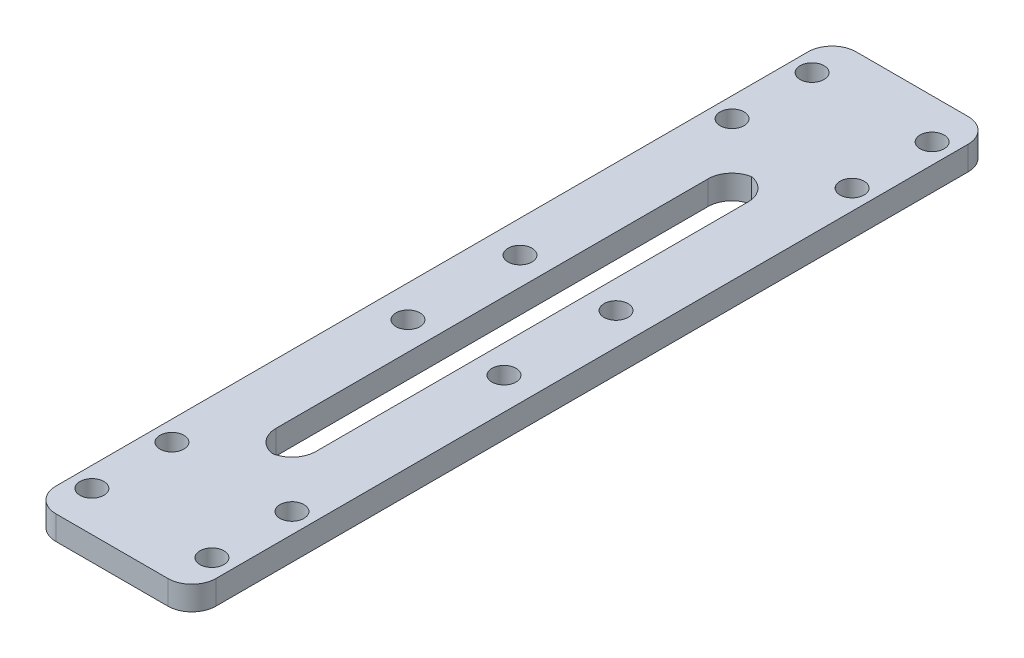
ISO-10303-21;
HEADER;
FILE_DESCRIPTION(('STEP AP214'),'2;1');
FILE_NAME('part.step','',(''),(''),'','','');
FILE_SCHEMA(('AUTOMOTIVE_DESIGN { 1 0 10303 214 1 1 1 1 }'));
ENDSEC;
DATA;
#1=APPLICATION_CONTEXT('core data for automotive mechanical design processes');
#2=APPLICATION_PROTOCOL_DEFINITION('international standard','automotive_design',2000,#1);
#3=PRODUCT_CONTEXT('',#1,'mechanical');
#4=PRODUCT('Part','Part','',(#3));
#5=PRODUCT_RELATED_PRODUCT_CATEGORY('part','',(#4));
#6=PRODUCT_DEFINITION_FORMATION('','',#4);
#7=PRODUCT_DEFINITION_CONTEXT('part definition',#1,'design');
#8=PRODUCT_DEFINITION('design','',#6,#7);
#9=PRODUCT_DEFINITION_SHAPE('','',#8);
#10=(LENGTH_UNIT() NAMED_UNIT(*) SI_UNIT(.MILLI.,.METRE.));
#11=(NAMED_UNIT(*) PLANE_ANGLE_UNIT() SI_UNIT($,.RADIAN.));
#12=(NAMED_UNIT(*) SI_UNIT($,.STERADIAN.) SOLID_ANGLE_UNIT());
#13=UNCERTAINTY_MEASURE_WITH_UNIT(LENGTH_MEASURE(1.E-05),#10,'distance_accuracy_value','');
#14=(GEOMETRIC_REPRESENTATION_CONTEXT(3) GLOBAL_UNCERTAINTY_ASSIGNED_CONTEXT((#13)) GLOBAL_UNIT_ASSIGNED_CONTEXT((#10,
#11,#12)) REPRESENTATION_CONTEXT('',''));
#15=CARTESIAN_POINT('',(0.,0.,0.));
#16=DIRECTION('',(0.,0.,1.));
#17=DIRECTION('',(1.,0.,0.));
#18=AXIS2_PLACEMENT_3D('',#15,#16,#17);
#19=CARTESIAN_POINT('',(10.,3.,50.));
#20=DIRECTION('',(-1.,0.,0.));
#21=DIRECTION('',(0.,0.,1.));
#22=AXIS2_PLACEMENT_3D('',#19,#20,#21);
#23=PLANE('',#22);
#24=DIRECTION('',(0.,0.,-1.));
#25=VECTOR('',#24,1.);
#26=CARTESIAN_POINT('',(10.,0.,50.));
#27=LINE('',#26,#25);
#28=CARTESIAN_POINT('',(10.,0.,47.));
#29=VERTEX_POINT('',#28);
#30=CARTESIAN_POINT('',(10.,0.,-47.));
#31=VERTEX_POINT('',#30);
#32=EDGE_CURVE('E239',#29,#31,#27,.T.);
#33=ORIENTED_EDGE('',*,*,#32,.T.);
#34=DIRECTION('',(0.,-1.,0.));
#35=VECTOR('',#34,1.);
#36=CARTESIAN_POINT('',(10.,3.,-47.));
#37=LINE('',#36,#35);
#38=CARTESIAN_POINT('',(10.,3.,-47.));
#39=VERTEX_POINT('',#38);
#40=EDGE_CURVE('E207',#31,#39,#37,.F.);
#41=ORIENTED_EDGE('',*,*,#40,.T.);
#42=DIRECTION('',(0.,0.,-1.));
#43=VECTOR('',#42,1.);
#44=CARTESIAN_POINT('',(10.,3.,50.));
#45=LINE('',#44,#43);
#46=CARTESIAN_POINT('',(10.,3.,47.));
#47=VERTEX_POINT('',#46);
#48=EDGE_CURVE('E238',#47,#39,#45,.T.);
#49=ORIENTED_EDGE('',*,*,#48,.F.);
#50=DIRECTION('',(0.,-1.,0.));
#51=VECTOR('',#50,1.);
#52=CARTESIAN_POINT('',(10.,3.,47.));
#53=LINE('',#52,#51);
#54=EDGE_CURVE('E204',#47,#29,#53,.T.);
#55=ORIENTED_EDGE('',*,*,#54,.T.);
#56=EDGE_LOOP('',(#33,#41,#49,#55));
#57=FACE_BOUND('',#56,.T.);
#58=ADVANCED_FACE('F35',(#57),#23,.F.);
#59=CARTESIAN_POINT('',(-10.,3.,-50.));
#60=DIRECTION('',(0.,0.,1.));
#61=DIRECTION('',(1.,0.,0.));
#62=AXIS2_PLACEMENT_3D('',#59,#60,#61);
#63=PLANE('',#62);
#64=DIRECTION('',(-1.,0.,0.));
#65=VECTOR('',#64,1.);
#66=CARTESIAN_POINT('',(-10.,3.,-50.));
#67=LINE('',#66,#65);
#68=CARTESIAN_POINT('',(7.,3.,-50.));
#69=VERTEX_POINT('',#68);
#70=CARTESIAN_POINT('',(-7.,3.,-50.));
#71=VERTEX_POINT('',#70);
#72=EDGE_CURVE('E247',#69,#71,#67,.T.);
#73=ORIENTED_EDGE('',*,*,#72,.F.);
#74=DIRECTION('',(0.,-1.,0.));
#75=VECTOR('',#74,1.);
#76=CARTESIAN_POINT('',(7.,3.,-50.));
#77=LINE('',#76,#75);
#78=CARTESIAN_POINT('',(7.,0.,-50.));
#79=VERTEX_POINT('',#78);
#80=EDGE_CURVE('E193',#69,#79,#77,.T.);
#81=ORIENTED_EDGE('',*,*,#80,.T.);
#82=DIRECTION('',(-1.,0.,0.));
#83=VECTOR('',#82,1.);
#84=CARTESIAN_POINT('',(-10.,0.,-50.));
#85=LINE('',#84,#83);
#86=CARTESIAN_POINT('',(-7.,0.,-50.));
#87=VERTEX_POINT('',#86);
#88=EDGE_CURVE('E236',#79,#87,#85,.T.);
#89=ORIENTED_EDGE('',*,*,#88,.T.);
#90=DIRECTION('',(0.,-1.,0.));
#91=VECTOR('',#90,1.);
#92=CARTESIAN_POINT('',(-7.,3.,-50.));
#93=LINE('',#92,#91);
#94=EDGE_CURVE('E185',#87,#71,#93,.F.);
#95=ORIENTED_EDGE('',*,*,#94,.T.);
#96=EDGE_LOOP('',(#73,#81,#89,#95));
#97=FACE_BOUND('',#96,.T.);
#98=ADVANCED_FACE('F374',(#97),#63,.F.);
#99=CARTESIAN_POINT('',(-10.,3.,50.));
#100=DIRECTION('',(1.,0.,0.));
#101=DIRECTION('',(0.,0.,-1.));
#102=AXIS2_PLACEMENT_3D('',#99,#100,#101);
#103=PLANE('',#102);
#104=DIRECTION('',(0.,0.,1.));
#105=VECTOR('',#104,1.);
#106=CARTESIAN_POINT('',(-10.,3.,50.));
#107=LINE('',#106,#105);
#108=CARTESIAN_POINT('',(-10.,3.,-47.));
#109=VERTEX_POINT('',#108);
#110=CARTESIAN_POINT('',(-10.,3.,47.));
#111=VERTEX_POINT('',#110);
#112=EDGE_CURVE('E228',#109,#111,#107,.T.);
#113=ORIENTED_EDGE('',*,*,#112,.F.);
#114=DIRECTION('',(0.,-1.,0.));
#115=VECTOR('',#114,1.);
#116=CARTESIAN_POINT('',(-10.,3.,-47.));
#117=LINE('',#116,#115);
#118=CARTESIAN_POINT('',(-10.,0.,-47.));
#119=VERTEX_POINT('',#118);
#120=EDGE_CURVE('E218',#109,#119,#117,.T.);
#121=ORIENTED_EDGE('',*,*,#120,.T.);
#122=DIRECTION('',(0.,0.,1.));
#123=VECTOR('',#122,1.);
#124=CARTESIAN_POINT('',(-10.,0.,50.));
#125=LINE('',#124,#123);
#126=CARTESIAN_POINT('',(-10.,0.,47.));
#127=VERTEX_POINT('',#126);
#128=EDGE_CURVE('E226',#119,#127,#125,.T.);
#129=ORIENTED_EDGE('',*,*,#128,.T.);
#130=DIRECTION('',(0.,-1.,0.));
#131=VECTOR('',#130,1.);
#132=CARTESIAN_POINT('',(-10.,3.,47.));
#133=LINE('',#132,#131);
#134=EDGE_CURVE('E216',#127,#111,#133,.F.);
#135=ORIENTED_EDGE('',*,*,#134,.T.);
#136=EDGE_LOOP('',(#113,#121,#129,#135));
#137=FACE_BOUND('',#136,.T.);
#138=ADVANCED_FACE('F225',(#137),#103,.F.);
#139=CARTESIAN_POINT('',(-10.,3.,50.));
#140=DIRECTION('',(0.,0.,-1.));
#141=DIRECTION('',(-1.,0.,0.));
#142=AXIS2_PLACEMENT_3D('',#139,#140,#141);
#143=PLANE('',#142);
#144=DIRECTION('',(1.,0.,0.));
#145=VECTOR('',#144,1.);
#146=CARTESIAN_POINT('',(-10.,3.,50.));
#147=LINE('',#146,#145);
#148=CARTESIAN_POINT('',(-7.,3.,50.));
#149=VERTEX_POINT('',#148);
#150=CARTESIAN_POINT('',(7.,3.,50.));
#151=VERTEX_POINT('',#150);
#152=EDGE_CURVE('E169',#149,#151,#147,.T.);
#153=ORIENTED_EDGE('',*,*,#152,.F.);
#154=DIRECTION('',(0.,-1.,0.));
#155=VECTOR('',#154,1.);
#156=CARTESIAN_POINT('',(-7.,3.,50.));
#157=LINE('',#156,#155);
#158=CARTESIAN_POINT('',(-7.,0.,50.));
#159=VERTEX_POINT('',#158);
#160=EDGE_CURVE('E11',#149,#159,#157,.T.);
#161=ORIENTED_EDGE('',*,*,#160,.T.);
#162=DIRECTION('',(1.,0.,0.));
#163=VECTOR('',#162,1.);
#164=CARTESIAN_POINT('',(-10.,0.,50.));
#165=LINE('',#164,#163);
#166=CARTESIAN_POINT('',(7.,0.,50.));
#167=VERTEX_POINT('',#166);
#168=EDGE_CURVE('E235',#159,#167,#165,.T.);
#169=ORIENTED_EDGE('',*,*,#168,.T.);
#170=DIRECTION('',(0.,-1.,0.));
#171=VECTOR('',#170,1.);
#172=CARTESIAN_POINT('',(7.,3.,50.));
#173=LINE('',#172,#171);
#174=EDGE_CURVE('E43',#167,#151,#173,.F.);
#175=ORIENTED_EDGE('',*,*,#174,.T.);
#176=EDGE_LOOP('',(#153,#161,#169,#175));
#177=FACE_BOUND('',#176,.T.);
#178=ADVANCED_FACE('F341',(#177),#143,.F.);
#179=CARTESIAN_POINT('',(0.,3.,0.));
#180=DIRECTION('',(0.,-1.,0.));
#181=DIRECTION('',(0.,0.,-1.));
#182=AXIS2_PLACEMENT_3D('',#179,#180,#181);
#183=PLANE('',#182);
#184=CARTESIAN_POINT('',(-6.,3.,7.));
#185=DIRECTION('',(0.,1.,0.));
#186=DIRECTION('',(0.,0.,-1.));
#187=AXIS2_PLACEMENT_3D('',#184,#185,#186);
#188=CIRCLE('',#187,1.5);
#189=CARTESIAN_POINT('',(-6.,3.,5.5));
#190=VERTEX_POINT('',#189);
#191=EDGE_CURVE('E310',#190,#190,#188,.T.);
#192=ORIENTED_EDGE('',*,*,#191,.F.);
#193=EDGE_LOOP('',(#192));
#194=FACE_BOUND('',#193,.T.);
#195=CARTESIAN_POINT('',(6.,3.,7.));
#196=DIRECTION('',(0.,1.,0.));
#197=DIRECTION('',(0.,0.,1.));
#198=AXIS2_PLACEMENT_3D('',#195,#196,#197);
#199=CIRCLE('',#198,1.5);
#200=CARTESIAN_POINT('',(6.,3.,8.5));
#201=VERTEX_POINT('',#200);
#202=EDGE_CURVE('E316',#201,#201,#199,.T.);
#203=ORIENTED_EDGE('',*,*,#202,.F.);
#204=EDGE_LOOP('',(#203));
#205=FACE_BOUND('',#204,.T.);
#206=CARTESIAN_POINT('',(6.,3.,-7.));
#207=DIRECTION('',(0.,1.,0.));
#208=DIRECTION('',(0.,0.,-1.));
#209=AXIS2_PLACEMENT_3D('',#206,#207,#208);
#210=CIRCLE('',#209,1.5);
#211=CARTESIAN_POINT('',(6.,3.,-8.5));
#212=VERTEX_POINT('',#211);
#213=EDGE_CURVE('E322',#212,#212,#210,.T.);
#214=ORIENTED_EDGE('',*,*,#213,.F.);
#215=EDGE_LOOP('',(#214));
#216=FACE_BOUND('',#215,.T.);
#217=CARTESIAN_POINT('',(-6.,3.,-7.));
#218=DIRECTION('',(0.,1.,0.));
#219=DIRECTION('',(0.,0.,1.));
#220=AXIS2_PLACEMENT_3D('',#217,#218,#219);
#221=CIRCLE('',#220,1.5);
#222=CARTESIAN_POINT('',(-6.,3.,-5.5));
#223=VERTEX_POINT('',#222);
#224=EDGE_CURVE('E304',#223,#223,#221,.T.);
#225=ORIENTED_EDGE('',*,*,#224,.F.);
#226=EDGE_LOOP('',(#225));
#227=FACE_BOUND('',#226,.T.);
#228=CARTESIAN_POINT('',(0.500000000000001,3.,-27.));
#229=DIRECTION('',(0.,-1.,0.));
#230=DIRECTION('',(0.,0.,-1.));
#231=AXIS2_PLACEMENT_3D('',#228,#229,#230);
#232=CIRCLE('',#231,3.);
#233=CARTESIAN_POINT('',(-2.5,3.,-27.));
#234=VERTEX_POINT('',#233);
#235=CARTESIAN_POINT('',(0.,3.,-29.9580398915498));
#236=VERTEX_POINT('',#235);
#237=EDGE_CURVE('E150',#234,#236,#232,.T.);
#238=ORIENTED_EDGE('',*,*,#237,.T.);
#239=CARTESIAN_POINT('',(-0.499999999999999,3.,-27.));
#240=DIRECTION('',(0.,-1.,0.));
#241=DIRECTION('',(0.,0.,-1.));
#242=AXIS2_PLACEMENT_3D('',#239,#240,#241);
#243=CIRCLE('',#242,3.);
#244=CARTESIAN_POINT('',(2.5,3.,-27.));
#245=VERTEX_POINT('',#244);
#246=EDGE_CURVE('E149',#236,#245,#243,.T.);
#247=ORIENTED_EDGE('',*,*,#246,.T.);
#248=DIRECTION('',(0.,0.,1.));
#249=VECTOR('',#248,1.);
#250=CARTESIAN_POINT('',(2.5,3.,0.));
#251=LINE('',#250,#249);
#252=CARTESIAN_POINT('',(2.5,3.,27.));
#253=VERTEX_POINT('',#252);
#254=EDGE_CURVE('E297',#245,#253,#251,.T.);
#255=ORIENTED_EDGE('',*,*,#254,.T.);
#256=CARTESIAN_POINT('',(-0.499999999999999,3.,27.));
#257=DIRECTION('',(0.,-1.,0.));
#258=DIRECTION('',(0.,0.,-1.));
#259=AXIS2_PLACEMENT_3D('',#256,#257,#258);
#260=CIRCLE('',#259,3.);
#261=CARTESIAN_POINT('',(0.,3.,29.9580398915498));
#262=VERTEX_POINT('',#261);
#263=EDGE_CURVE('E181',#253,#262,#260,.T.);
#264=ORIENTED_EDGE('',*,*,#263,.T.);
#265=CARTESIAN_POINT('',(0.500000000000001,3.,27.));
#266=DIRECTION('',(0.,-1.,0.));
#267=DIRECTION('',(0.,0.,-1.));
#268=AXIS2_PLACEMENT_3D('',#265,#266,#267);
#269=CIRCLE('',#268,3.);
#270=CARTESIAN_POINT('',(-2.5,3.,27.));
#271=VERTEX_POINT('',#270);
#272=EDGE_CURVE('E177',#262,#271,#269,.T.);
#273=ORIENTED_EDGE('',*,*,#272,.T.);
#274=DIRECTION('',(0.,0.,-1.));
#275=VECTOR('',#274,1.);
#276=CARTESIAN_POINT('',(-2.5,3.,0.));
#277=LINE('',#276,#275);
#278=EDGE_CURVE('E161',#271,#234,#277,.T.);
#279=ORIENTED_EDGE('',*,*,#278,.T.);
#280=EDGE_LOOP('',(#238,#247,#255,#264,#273,#279));
#281=FACE_BOUND('',#280,.T.);
#282=CARTESIAN_POINT('',(7.50000000000002,3.,35.));
#283=DIRECTION('',(0.,1.,0.));
#284=DIRECTION('',(0.,0.,1.));
#285=AXIS2_PLACEMENT_3D('',#282,#283,#284);
#286=CIRCLE('',#285,1.50000000000001);
#287=CARTESIAN_POINT('',(7.50000000000002,3.,36.5));
#288=VERTEX_POINT('',#287);
#289=EDGE_CURVE('E270',#288,#288,#286,.T.);
#290=ORIENTED_EDGE('',*,*,#289,.F.);
#291=EDGE_LOOP('',(#290));
#292=FACE_BOUND('',#291,.T.);
#293=CARTESIAN_POINT('',(7.5,3.,-35.));
#294=DIRECTION('',(0.,1.,0.));
#295=DIRECTION('',(0.,0.,-1.));
#296=AXIS2_PLACEMENT_3D('',#293,#294,#295);
#297=CIRCLE('',#296,1.50000000000001);
#298=CARTESIAN_POINT('',(7.5,3.,-36.5));
#299=VERTEX_POINT('',#298);
#300=EDGE_CURVE('E277',#299,#299,#297,.T.);
#301=ORIENTED_EDGE('',*,*,#300,.F.);
#302=EDGE_LOOP('',(#301));
#303=FACE_BOUND('',#302,.T.);
#304=CARTESIAN_POINT('',(7.5,3.,-45.));
#305=DIRECTION('',(0.,1.,0.));
#306=DIRECTION('',(0.,0.,-1.));
#307=AXIS2_PLACEMENT_3D('',#304,#305,#306);
#308=CIRCLE('',#307,1.5);
#309=CARTESIAN_POINT('',(7.5,3.,-46.5));
#310=VERTEX_POINT('',#309);
#311=EDGE_CURVE('E258',#310,#310,#308,.T.);
#312=ORIENTED_EDGE('',*,*,#311,.F.);
#313=EDGE_LOOP('',(#312));
#314=FACE_BOUND('',#313,.T.);
#315=CARTESIAN_POINT('',(-7.5,3.,-35.));
#316=DIRECTION('',(0.,1.,0.));
#317=DIRECTION('',(0.,0.,1.));
#318=AXIS2_PLACEMENT_3D('',#315,#316,#317);
#319=CIRCLE('',#318,1.5);
#320=CARTESIAN_POINT('',(-7.5,3.,-33.5));
#321=VERTEX_POINT('',#320);
#322=EDGE_CURVE('E265',#321,#321,#319,.T.);
#323=ORIENTED_EDGE('',*,*,#322,.F.);
#324=EDGE_LOOP('',(#323));
#325=FACE_BOUND('',#324,.T.);
#326=CARTESIAN_POINT('',(-7.49999999999997,3.,45.));
#327=DIRECTION('',(0.,1.,0.));
#328=DIRECTION('',(0.,0.,-1.));
#329=AXIS2_PLACEMENT_3D('',#326,#327,#328);
#330=CIRCLE('',#329,1.5);
#331=CARTESIAN_POINT('',(-7.49999999999997,3.,43.5));
#332=VERTEX_POINT('',#331);
#333=EDGE_CURVE('E294',#332,#332,#330,.T.);
#334=ORIENTED_EDGE('',*,*,#333,.F.);
#335=EDGE_LOOP('',(#334));
#336=FACE_BOUND('',#335,.T.);
#337=CARTESIAN_POINT('',(-7.5,3.,35.));
#338=DIRECTION('',(0.,1.,0.));
#339=DIRECTION('',(0.,0.,-1.));
#340=AXIS2_PLACEMENT_3D('',#337,#338,#339);
#341=CIRCLE('',#340,1.5);
#342=CARTESIAN_POINT('',(-7.5,3.,33.5));
#343=VERTEX_POINT('',#342);
#344=EDGE_CURVE('E282',#343,#343,#341,.T.);
#345=ORIENTED_EDGE('',*,*,#344,.F.);
#346=EDGE_LOOP('',(#345));
#347=FACE_BOUND('',#346,.T.);
#348=CARTESIAN_POINT('',(7.49999999999998,3.,45.));
#349=DIRECTION('',(0.,1.,0.));
#350=DIRECTION('',(0.,0.,1.));
#351=AXIS2_PLACEMENT_3D('',#348,#349,#350);
#352=CIRCLE('',#351,1.5);
#353=CARTESIAN_POINT('',(7.49999999999998,3.,46.5));
#354=VERTEX_POINT('',#353);
#355=EDGE_CURVE('E289',#354,#354,#352,.T.);
#356=ORIENTED_EDGE('',*,*,#355,.F.);
#357=EDGE_LOOP('',(#356));
#358=FACE_BOUND('',#357,.T.);
#359=CARTESIAN_POINT('',(-7.5,3.,-45.));
#360=DIRECTION('',(0.,1.,0.));
#361=DIRECTION('',(0.,0.,1.));
#362=AXIS2_PLACEMENT_3D('',#359,#360,#361);
#363=CIRCLE('',#362,1.5);
#364=CARTESIAN_POINT('',(-7.5,3.,-43.5));
#365=VERTEX_POINT('',#364);
#366=EDGE_CURVE('E252',#365,#365,#363,.T.);
#367=ORIENTED_EDGE('',*,*,#366,.F.);
#368=EDGE_LOOP('',(#367));
#369=FACE_BOUND('',#368,.T.);
#370=ORIENTED_EDGE('',*,*,#48,.T.);
#371=CARTESIAN_POINT('',(7.,3.,-47.));
#372=DIRECTION('',(0.,-1.,0.));
#373=DIRECTION('',(0.,0.,-1.));
#374=AXIS2_PLACEMENT_3D('',#371,#372,#373);
#375=CIRCLE('',#374,3.);
#376=EDGE_CURVE('E214',#39,#69,#375,.F.);
#377=ORIENTED_EDGE('',*,*,#376,.T.);
#378=ORIENTED_EDGE('',*,*,#72,.T.);
#379=CARTESIAN_POINT('',(-7.,3.,-47.));
#380=DIRECTION('',(0.,-1.,0.));
#381=DIRECTION('',(0.,0.,-1.));
#382=AXIS2_PLACEMENT_3D('',#379,#380,#381);
#383=CIRCLE('',#382,3.);
#384=EDGE_CURVE('E212',#71,#109,#383,.F.);
#385=ORIENTED_EDGE('',*,*,#384,.T.);
#386=ORIENTED_EDGE('',*,*,#112,.T.);
#387=CARTESIAN_POINT('',(-7.,3.,47.));
#388=DIRECTION('',(0.,-1.,0.));
#389=DIRECTION('',(0.,0.,-1.));
#390=AXIS2_PLACEMENT_3D('',#387,#388,#389);
#391=CIRCLE('',#390,3.);
#392=EDGE_CURVE('E56',#111,#149,#391,.F.);
#393=ORIENTED_EDGE('',*,*,#392,.T.);
#394=ORIENTED_EDGE('',*,*,#152,.T.);
#395=CARTESIAN_POINT('',(7.,3.,47.));
#396=DIRECTION('',(0.,-1.,0.));
#397=DIRECTION('',(0.,0.,-1.));
#398=AXIS2_PLACEMENT_3D('',#395,#396,#397);
#399=CIRCLE('',#398,3.);
#400=EDGE_CURVE('E209',#151,#47,#399,.F.);
#401=ORIENTED_EDGE('',*,*,#400,.T.);
#402=EDGE_LOOP('',(#370,#377,#378,#385,#386,#393,#394,#401));
#403=FACE_BOUND('',#402,.T.);
#404=ADVANCED_FACE('F338',(#194,#205,#216,#227,#281,#292,#303,#314,#325,#336,#347,#358,#369,
#403),#183,.F.);
#405=CARTESIAN_POINT('',(0.,0.,0.));
#406=DIRECTION('',(0.,-1.,0.));
#407=DIRECTION('',(0.,0.,-1.));
#408=AXIS2_PLACEMENT_3D('',#405,#406,#407);
#409=PLANE('',#408);
#410=CARTESIAN_POINT('',(-6.,0.,7.));
#411=DIRECTION('',(0.,1.,0.));
#412=DIRECTION('',(0.,0.,-1.));
#413=AXIS2_PLACEMENT_3D('',#410,#411,#412);
#414=CIRCLE('',#413,1.5);
#415=CARTESIAN_POINT('',(-6.,0.,5.5));
#416=VERTEX_POINT('',#415);
#417=EDGE_CURVE('E313',#416,#416,#414,.T.);
#418=ORIENTED_EDGE('',*,*,#417,.T.);
#419=EDGE_LOOP('',(#418));
#420=FACE_BOUND('',#419,.T.);
#421=CARTESIAN_POINT('',(6.,0.,7.));
#422=DIRECTION('',(0.,1.,0.));
#423=DIRECTION('',(0.,0.,1.));
#424=AXIS2_PLACEMENT_3D('',#421,#422,#423);
#425=CIRCLE('',#424,1.5);
#426=CARTESIAN_POINT('',(6.,0.,8.5));
#427=VERTEX_POINT('',#426);
#428=EDGE_CURVE('E319',#427,#427,#425,.T.);
#429=ORIENTED_EDGE('',*,*,#428,.T.);
#430=EDGE_LOOP('',(#429));
#431=FACE_BOUND('',#430,.T.);
#432=CARTESIAN_POINT('',(6.,0.,-7.));
#433=DIRECTION('',(0.,1.,0.));
#434=DIRECTION('',(0.,0.,-1.));
#435=AXIS2_PLACEMENT_3D('',#432,#433,#434);
#436=CIRCLE('',#435,1.5);
#437=CARTESIAN_POINT('',(6.,0.,-8.5));
#438=VERTEX_POINT('',#437);
#439=EDGE_CURVE('E307',#438,#438,#436,.T.);
#440=ORIENTED_EDGE('',*,*,#439,.T.);
#441=EDGE_LOOP('',(#440));
#442=FACE_BOUND('',#441,.T.);
#443=CARTESIAN_POINT('',(-6.,0.,-7.));
#444=DIRECTION('',(0.,1.,0.));
#445=DIRECTION('',(0.,0.,1.));
#446=AXIS2_PLACEMENT_3D('',#443,#444,#445);
#447=CIRCLE('',#446,1.5);
#448=CARTESIAN_POINT('',(-6.,0.,-5.5));
#449=VERTEX_POINT('',#448);
#450=EDGE_CURVE('E191',#449,#449,#447,.T.);
#451=ORIENTED_EDGE('',*,*,#450,.T.);
#452=EDGE_LOOP('',(#451));
#453=FACE_BOUND('',#452,.T.);
#454=CARTESIAN_POINT('',(0.500000000000001,0.,27.));
#455=DIRECTION('',(0.,-1.,0.));
#456=DIRECTION('',(0.,0.,-1.));
#457=AXIS2_PLACEMENT_3D('',#454,#455,#456);
#458=CIRCLE('',#457,3.);
#459=CARTESIAN_POINT('',(-2.5,0.,27.));
#460=VERTEX_POINT('',#459);
#461=CARTESIAN_POINT('',(0.,0.,29.9580398915498));
#462=VERTEX_POINT('',#461);
#463=EDGE_CURVE('E179',#460,#462,#458,.F.);
#464=ORIENTED_EDGE('',*,*,#463,.T.);
#465=CARTESIAN_POINT('',(-0.499999999999999,0.,27.));
#466=DIRECTION('',(0.,-1.,0.));
#467=DIRECTION('',(0.,0.,-1.));
#468=AXIS2_PLACEMENT_3D('',#465,#466,#467);
#469=CIRCLE('',#468,3.);
#470=CARTESIAN_POINT('',(2.5,0.,27.));
#471=VERTEX_POINT('',#470);
#472=EDGE_CURVE('E183',#462,#471,#469,.F.);
#473=ORIENTED_EDGE('',*,*,#472,.T.);
#474=DIRECTION('',(0.,0.,-1.));
#475=VECTOR('',#474,1.);
#476=CARTESIAN_POINT('',(2.5,0.,30.));
#477=LINE('',#476,#475);
#478=CARTESIAN_POINT('',(2.5,0.,-27.));
#479=VERTEX_POINT('',#478);
#480=EDGE_CURVE('E162',#471,#479,#477,.T.);
#481=ORIENTED_EDGE('',*,*,#480,.T.);
#482=CARTESIAN_POINT('',(-0.499999999999999,0.,-27.));
#483=DIRECTION('',(0.,-1.,0.));
#484=DIRECTION('',(0.,0.,-1.));
#485=AXIS2_PLACEMENT_3D('',#482,#483,#484);
#486=CIRCLE('',#485,3.);
#487=CARTESIAN_POINT('',(0.,0.,-29.9580398915498));
#488=VERTEX_POINT('',#487);
#489=EDGE_CURVE('E144',#479,#488,#486,.F.);
#490=ORIENTED_EDGE('',*,*,#489,.T.);
#491=CARTESIAN_POINT('',(0.500000000000001,0.,-27.));
#492=DIRECTION('',(0.,-1.,0.));
#493=DIRECTION('',(0.,0.,-1.));
#494=AXIS2_PLACEMENT_3D('',#491,#492,#493);
#495=CIRCLE('',#494,3.);
#496=CARTESIAN_POINT('',(-2.5,0.,-27.));
#497=VERTEX_POINT('',#496);
#498=EDGE_CURVE('E137',#488,#497,#495,.F.);
#499=ORIENTED_EDGE('',*,*,#498,.T.);
#500=DIRECTION('',(0.,0.,1.));
#501=VECTOR('',#500,1.);
#502=CARTESIAN_POINT('',(-2.5,0.,30.));
#503=LINE('',#502,#501);
#504=EDGE_CURVE('E141',#497,#460,#503,.T.);
#505=ORIENTED_EDGE('',*,*,#504,.T.);
#506=EDGE_LOOP('',(#464,#473,#481,#490,#499,#505));
#507=FACE_BOUND('',#506,.T.);
#508=CARTESIAN_POINT('',(7.50000000000002,0.,35.));
#509=DIRECTION('',(0.,1.,0.));
#510=DIRECTION('',(0.,0.,1.));
#511=AXIS2_PLACEMENT_3D('',#508,#509,#510);
#512=CIRCLE('',#511,1.50000000000001);
#513=CARTESIAN_POINT('',(7.50000000000002,0.,36.5));
#514=VERTEX_POINT('',#513);
#515=EDGE_CURVE('E273',#514,#514,#512,.T.);
#516=ORIENTED_EDGE('',*,*,#515,.T.);
#517=EDGE_LOOP('',(#516));
#518=FACE_BOUND('',#517,.T.);
#519=CARTESIAN_POINT('',(7.5,0.,-35.));
#520=DIRECTION('',(0.,1.,0.));
#521=DIRECTION('',(0.,0.,-1.));
#522=AXIS2_PLACEMENT_3D('',#519,#520,#521);
#523=CIRCLE('',#522,1.50000000000001);
#524=CARTESIAN_POINT('',(7.5,0.,-36.5));
#525=VERTEX_POINT('',#524);
#526=EDGE_CURVE('E262',#525,#525,#523,.T.);
#527=ORIENTED_EDGE('',*,*,#526,.T.);
#528=EDGE_LOOP('',(#527));
#529=FACE_BOUND('',#528,.T.);
#530=CARTESIAN_POINT('',(7.5,0.,-45.));
#531=DIRECTION('',(0.,1.,0.));
#532=DIRECTION('',(0.,0.,-1.));
#533=AXIS2_PLACEMENT_3D('',#530,#531,#532);
#534=CIRCLE('',#533,1.5);
#535=CARTESIAN_POINT('',(7.5,0.,-46.5));
#536=VERTEX_POINT('',#535);
#537=EDGE_CURVE('E261',#536,#536,#534,.T.);
#538=ORIENTED_EDGE('',*,*,#537,.T.);
#539=EDGE_LOOP('',(#538));
#540=FACE_BOUND('',#539,.T.);
#541=CARTESIAN_POINT('',(-7.5,0.,-35.));
#542=DIRECTION('',(0.,1.,0.));
#543=DIRECTION('',(0.,0.,1.));
#544=AXIS2_PLACEMENT_3D('',#541,#542,#543);
#545=CIRCLE('',#544,1.5);
#546=CARTESIAN_POINT('',(-7.5,0.,-33.5));
#547=VERTEX_POINT('',#546);
#548=EDGE_CURVE('E255',#547,#547,#545,.T.);
#549=ORIENTED_EDGE('',*,*,#548,.T.);
#550=EDGE_LOOP('',(#549));
#551=FACE_BOUND('',#550,.T.);
#552=CARTESIAN_POINT('',(-7.49999999999997,0.,45.));
#553=DIRECTION('',(0.,1.,0.));
#554=DIRECTION('',(0.,0.,-1.));
#555=AXIS2_PLACEMENT_3D('',#552,#553,#554);
#556=CIRCLE('',#555,1.5);
#557=CARTESIAN_POINT('',(-7.49999999999997,0.,43.5));
#558=VERTEX_POINT('',#557);
#559=EDGE_CURVE('E286',#558,#558,#556,.T.);
#560=ORIENTED_EDGE('',*,*,#559,.T.);
#561=EDGE_LOOP('',(#560));
#562=FACE_BOUND('',#561,.T.);
#563=CARTESIAN_POINT('',(-7.5,0.,35.));
#564=DIRECTION('',(0.,1.,0.));
#565=DIRECTION('',(0.,0.,-1.));
#566=AXIS2_PLACEMENT_3D('',#563,#564,#565);
#567=CIRCLE('',#566,1.5);
#568=CARTESIAN_POINT('',(-7.5,0.,33.5));
#569=VERTEX_POINT('',#568);
#570=EDGE_CURVE('E285',#569,#569,#567,.T.);
#571=ORIENTED_EDGE('',*,*,#570,.T.);
#572=EDGE_LOOP('',(#571));
#573=FACE_BOUND('',#572,.T.);
#574=CARTESIAN_POINT('',(7.49999999999998,0.,45.));
#575=DIRECTION('',(0.,1.,0.));
#576=DIRECTION('',(0.,0.,1.));
#577=AXIS2_PLACEMENT_3D('',#574,#575,#576);
#578=CIRCLE('',#577,1.5);
#579=CARTESIAN_POINT('',(7.49999999999998,0.,46.5));
#580=VERTEX_POINT('',#579);
#581=EDGE_CURVE('E274',#580,#580,#578,.T.);
#582=ORIENTED_EDGE('',*,*,#581,.T.);
#583=EDGE_LOOP('',(#582));
#584=FACE_BOUND('',#583,.T.);
#585=CARTESIAN_POINT('',(-7.5,0.,-45.));
#586=DIRECTION('',(0.,1.,0.));
#587=DIRECTION('',(0.,0.,1.));
#588=AXIS2_PLACEMENT_3D('',#585,#586,#587);
#589=CIRCLE('',#588,1.5);
#590=CARTESIAN_POINT('',(-7.5,0.,-43.5));
#591=VERTEX_POINT('',#590);
#592=EDGE_CURVE('E244',#591,#591,#589,.T.);
#593=ORIENTED_EDGE('',*,*,#592,.T.);
#594=EDGE_LOOP('',(#593));
#595=FACE_BOUND('',#594,.T.);
#596=ORIENTED_EDGE('',*,*,#88,.F.);
#597=CARTESIAN_POINT('',(7.,0.,-47.));
#598=DIRECTION('',(0.,-1.,0.));
#599=DIRECTION('',(0.,0.,-1.));
#600=AXIS2_PLACEMENT_3D('',#597,#598,#599);
#601=CIRCLE('',#600,3.);
#602=EDGE_CURVE('E202',#79,#31,#601,.T.);
#603=ORIENTED_EDGE('',*,*,#602,.T.);
#604=ORIENTED_EDGE('',*,*,#32,.F.);
#605=CARTESIAN_POINT('',(7.,0.,47.));
#606=DIRECTION('',(0.,-1.,0.));
#607=DIRECTION('',(0.,0.,-1.));
#608=AXIS2_PLACEMENT_3D('',#605,#606,#607);
#609=CIRCLE('',#608,3.);
#610=EDGE_CURVE('E196',#29,#167,#609,.T.);
#611=ORIENTED_EDGE('',*,*,#610,.T.);
#612=ORIENTED_EDGE('',*,*,#168,.F.);
#613=CARTESIAN_POINT('',(-7.,0.,47.));
#614=DIRECTION('',(0.,-1.,0.));
#615=DIRECTION('',(0.,0.,-1.));
#616=AXIS2_PLACEMENT_3D('',#613,#614,#615);
#617=CIRCLE('',#616,3.);
#618=EDGE_CURVE('E198',#159,#127,#617,.T.);
#619=ORIENTED_EDGE('',*,*,#618,.T.);
#620=ORIENTED_EDGE('',*,*,#128,.F.);
#621=CARTESIAN_POINT('',(-7.,0.,-47.));
#622=DIRECTION('',(0.,-1.,0.));
#623=DIRECTION('',(0.,0.,-1.));
#624=AXIS2_PLACEMENT_3D('',#621,#622,#623);
#625=CIRCLE('',#624,3.);
#626=EDGE_CURVE('E200',#119,#87,#625,.T.);
#627=ORIENTED_EDGE('',*,*,#626,.T.);
#628=EDGE_LOOP('',(#596,#603,#604,#611,#612,#619,#620,#627));
#629=FACE_BOUND('',#628,.T.);
#630=ADVANCED_FACE('F139',(#420,#431,#442,#453,#507,#518,#529,#540,#551,#562,#573,#584,#595,
#629),#409,.T.);
#631=CARTESIAN_POINT('',(-7.5,0.,-45.));
#632=DIRECTION('',(0.,1.,0.));
#633=DIRECTION('',(0.,0.,1.));
#634=AXIS2_PLACEMENT_3D('',#631,#632,#633);
#635=CYLINDRICAL_SURFACE('',#634,1.5);
#636=ORIENTED_EDGE('',*,*,#592,.F.);
#637=EDGE_LOOP('',(#636));
#638=FACE_BOUND('',#637,.T.);
#639=ORIENTED_EDGE('',*,*,#366,.T.);
#640=EDGE_LOOP('',(#639));
#641=FACE_BOUND('',#640,.T.);
#642=ADVANCED_FACE('F444',(#638,#641),#635,.F.);
#643=CARTESIAN_POINT('',(7.49999999999998,0.,45.));
#644=DIRECTION('',(0.,1.,0.));
#645=DIRECTION('',(0.,0.,1.));
#646=AXIS2_PLACEMENT_3D('',#643,#644,#645);
#647=CYLINDRICAL_SURFACE('',#646,1.5);
#648=ORIENTED_EDGE('',*,*,#581,.F.);
#649=EDGE_LOOP('',(#648));
#650=FACE_BOUND('',#649,.T.);
#651=ORIENTED_EDGE('',*,*,#355,.T.);
#652=EDGE_LOOP('',(#651));
#653=FACE_BOUND('',#652,.T.);
#654=ADVANCED_FACE('F441',(#650,#653),#647,.F.);
#655=CARTESIAN_POINT('',(-7.5,0.,35.));
#656=DIRECTION('',(0.,1.,0.));
#657=DIRECTION('',(0.,0.,1.));
#658=AXIS2_PLACEMENT_3D('',#655,#656,#657);
#659=CYLINDRICAL_SURFACE('',#658,1.5);
#660=ORIENTED_EDGE('',*,*,#570,.F.);
#661=EDGE_LOOP('',(#660));
#662=FACE_BOUND('',#661,.T.);
#663=ORIENTED_EDGE('',*,*,#344,.T.);
#664=EDGE_LOOP('',(#663));
#665=FACE_BOUND('',#664,.T.);
#666=ADVANCED_FACE('F439',(#662,#665),#659,.F.);
#667=CARTESIAN_POINT('',(-7.49999999999997,0.,45.));
#668=DIRECTION('',(0.,1.,0.));
#669=DIRECTION('',(0.,0.,1.));
#670=AXIS2_PLACEMENT_3D('',#667,#668,#669);
#671=CYLINDRICAL_SURFACE('',#670,1.5);
#672=ORIENTED_EDGE('',*,*,#559,.F.);
#673=EDGE_LOOP('',(#672));
#674=FACE_BOUND('',#673,.T.);
#675=ORIENTED_EDGE('',*,*,#333,.T.);
#676=EDGE_LOOP('',(#675));
#677=FACE_BOUND('',#676,.T.);
#678=ADVANCED_FACE('F435',(#674,#677),#671,.F.);
#679=CARTESIAN_POINT('',(-7.5,0.,-35.));
#680=DIRECTION('',(0.,1.,0.));
#681=DIRECTION('',(0.,0.,1.));
#682=AXIS2_PLACEMENT_3D('',#679,#680,#681);
#683=CYLINDRICAL_SURFACE('',#682,1.5);
#684=ORIENTED_EDGE('',*,*,#548,.F.);
#685=EDGE_LOOP('',(#684));
#686=FACE_BOUND('',#685,.T.);
#687=ORIENTED_EDGE('',*,*,#322,.T.);
#688=EDGE_LOOP('',(#687));
#689=FACE_BOUND('',#688,.T.);
#690=ADVANCED_FACE('F438',(#686,#689),#683,.F.);
#691=CARTESIAN_POINT('',(7.5,0.,-45.));
#692=DIRECTION('',(0.,1.,0.));
#693=DIRECTION('',(0.,0.,1.));
#694=AXIS2_PLACEMENT_3D('',#691,#692,#693);
#695=CYLINDRICAL_SURFACE('',#694,1.5);
#696=ORIENTED_EDGE('',*,*,#537,.F.);
#697=EDGE_LOOP('',(#696));
#698=FACE_BOUND('',#697,.T.);
#699=ORIENTED_EDGE('',*,*,#311,.T.);
#700=EDGE_LOOP('',(#699));
#701=FACE_BOUND('',#700,.T.);
#702=ADVANCED_FACE('F450',(#698,#701),#695,.F.);
#703=CARTESIAN_POINT('',(7.5,0.,-35.));
#704=DIRECTION('',(0.,1.,0.));
#705=DIRECTION('',(0.,0.,1.));
#706=AXIS2_PLACEMENT_3D('',#703,#704,#705);
#707=CYLINDRICAL_SURFACE('',#706,1.50000000000001);
#708=ORIENTED_EDGE('',*,*,#526,.F.);
#709=EDGE_LOOP('',(#708));
#710=FACE_BOUND('',#709,.T.);
#711=ORIENTED_EDGE('',*,*,#300,.T.);
#712=EDGE_LOOP('',(#711));
#713=FACE_BOUND('',#712,.T.);
#714=ADVANCED_FACE('F430',(#710,#713),#707,.F.);
#715=CARTESIAN_POINT('',(7.50000000000002,0.,35.));
#716=DIRECTION('',(0.,1.,0.));
#717=DIRECTION('',(0.,0.,1.));
#718=AXIS2_PLACEMENT_3D('',#715,#716,#717);
#719=CYLINDRICAL_SURFACE('',#718,1.50000000000001);
#720=ORIENTED_EDGE('',*,*,#515,.F.);
#721=EDGE_LOOP('',(#720));
#722=FACE_BOUND('',#721,.T.);
#723=ORIENTED_EDGE('',*,*,#289,.T.);
#724=EDGE_LOOP('',(#723));
#725=FACE_BOUND('',#724,.T.);
#726=ADVANCED_FACE('F423',(#722,#725),#719,.F.);
#727=CARTESIAN_POINT('',(2.5,0.,30.));
#728=DIRECTION('',(1.,0.,0.));
#729=DIRECTION('',(0.,0.,-1.));
#730=AXIS2_PLACEMENT_3D('',#727,#728,#729);
#731=PLANE('',#730);
#732=ORIENTED_EDGE('',*,*,#254,.F.);
#733=DIRECTION('',(0.,1.,0.));
#734=VECTOR('',#733,1.);
#735=CARTESIAN_POINT('',(2.5,0.,-27.));
#736=LINE('',#735,#734);
#737=EDGE_CURVE('E167',#245,#479,#736,.F.);
#738=ORIENTED_EDGE('',*,*,#737,.T.);
#739=ORIENTED_EDGE('',*,*,#480,.F.);
#740=DIRECTION('',(0.,1.,0.));
#741=VECTOR('',#740,1.);
#742=CARTESIAN_POINT('',(2.5,3.,27.));
#743=LINE('',#742,#741);
#744=EDGE_CURVE('E165',#471,#253,#743,.T.);
#745=ORIENTED_EDGE('',*,*,#744,.T.);
#746=EDGE_LOOP('',(#732,#738,#739,#745));
#747=FACE_BOUND('',#746,.T.);
#748=ADVANCED_FACE('F419',(#747),#731,.F.);
#749=CARTESIAN_POINT('',(-2.5,0.,30.));
#750=DIRECTION('',(-1.,0.,0.));
#751=DIRECTION('',(0.,0.,1.));
#752=AXIS2_PLACEMENT_3D('',#749,#750,#751);
#753=PLANE('',#752);
#754=ORIENTED_EDGE('',*,*,#504,.F.);
#755=DIRECTION('',(0.,1.,0.));
#756=VECTOR('',#755,1.);
#757=CARTESIAN_POINT('',(-2.5,3.,-27.));
#758=LINE('',#757,#756);
#759=EDGE_CURVE('E157',#497,#234,#758,.T.);
#760=ORIENTED_EDGE('',*,*,#759,.T.);
#761=ORIENTED_EDGE('',*,*,#278,.F.);
#762=DIRECTION('',(0.,1.,0.));
#763=VECTOR('',#762,1.);
#764=CARTESIAN_POINT('',(-2.5,0.,27.));
#765=LINE('',#764,#763);
#766=EDGE_CURVE('E160',#271,#460,#765,.F.);
#767=ORIENTED_EDGE('',*,*,#766,.T.);
#768=EDGE_LOOP('',(#754,#760,#761,#767));
#769=FACE_BOUND('',#768,.T.);
#770=ADVANCED_FACE('F155',(#769),#753,.F.);
#771=CARTESIAN_POINT('',(-0.499999999999999,0.,-27.));
#772=DIRECTION('',(0.,-1.,0.));
#773=DIRECTION('',(0.,0.,-1.));
#774=AXIS2_PLACEMENT_3D('',#771,#772,#773);
#775=CYLINDRICAL_SURFACE('',#774,3.);
#776=DIRECTION('',(0.,-1.,0.));
#777=VECTOR('',#776,1.);
#778=CARTESIAN_POINT('',(0.,1.5,-29.9580398915498));
#779=LINE('',#778,#777);
#780=EDGE_CURVE('E186',#488,#236,#779,.F.);
#781=ORIENTED_EDGE('',*,*,#780,.F.);
#782=ORIENTED_EDGE('',*,*,#489,.F.);
#783=ORIENTED_EDGE('',*,*,#737,.F.);
#784=ORIENTED_EDGE('',*,*,#246,.F.);
#785=EDGE_LOOP('',(#781,#782,#783,#784));
#786=FACE_BOUND('',#785,.T.);
#787=ADVANCED_FACE('F401',(#786),#775,.F.);
#788=CARTESIAN_POINT('',(0.500000000000001,0.,-27.));
#789=DIRECTION('',(0.,-1.,0.));
#790=DIRECTION('',(0.,0.,-1.));
#791=AXIS2_PLACEMENT_3D('',#788,#789,#790);
#792=CYLINDRICAL_SURFACE('',#791,3.);
#793=ORIENTED_EDGE('',*,*,#498,.F.);
#794=ORIENTED_EDGE('',*,*,#780,.T.);
#795=ORIENTED_EDGE('',*,*,#237,.F.);
#796=ORIENTED_EDGE('',*,*,#759,.F.);
#797=EDGE_LOOP('',(#793,#794,#795,#796));
#798=FACE_BOUND('',#797,.T.);
#799=ADVANCED_FACE('F164',(#798),#792,.F.);
#800=CARTESIAN_POINT('',(-0.499999999999999,0.,27.));
#801=DIRECTION('',(0.,-1.,0.));
#802=DIRECTION('',(0.,0.,-1.));
#803=AXIS2_PLACEMENT_3D('',#800,#801,#802);
#804=CYLINDRICAL_SURFACE('',#803,3.);
#805=ORIENTED_EDGE('',*,*,#744,.F.);
#806=ORIENTED_EDGE('',*,*,#472,.F.);
#807=DIRECTION('',(0.,-1.,0.));
#808=VECTOR('',#807,1.);
#809=CARTESIAN_POINT('',(0.,1.5,29.9580398915498));
#810=LINE('',#809,#808);
#811=EDGE_CURVE('E188',#262,#462,#810,.T.);
#812=ORIENTED_EDGE('',*,*,#811,.F.);
#813=ORIENTED_EDGE('',*,*,#263,.F.);
#814=EDGE_LOOP('',(#805,#806,#812,#813));
#815=FACE_BOUND('',#814,.T.);
#816=ADVANCED_FACE('F400',(#815),#804,.F.);
#817=CARTESIAN_POINT('',(0.500000000000001,0.,27.));
#818=DIRECTION('',(0.,-1.,0.));
#819=DIRECTION('',(0.,0.,-1.));
#820=AXIS2_PLACEMENT_3D('',#817,#818,#819);
#821=CYLINDRICAL_SURFACE('',#820,3.);
#822=ORIENTED_EDGE('',*,*,#463,.F.);
#823=ORIENTED_EDGE('',*,*,#766,.F.);
#824=ORIENTED_EDGE('',*,*,#272,.F.);
#825=ORIENTED_EDGE('',*,*,#811,.T.);
#826=EDGE_LOOP('',(#822,#823,#824,#825));
#827=FACE_BOUND('',#826,.T.);
#828=ADVANCED_FACE('F388',(#827),#821,.F.);
#829=CARTESIAN_POINT('',(7.,3.,-47.));
#830=DIRECTION('',(0.,-1.,0.));
#831=DIRECTION('',(0.,0.,-1.));
#832=AXIS2_PLACEMENT_3D('',#829,#830,#831);
#833=CYLINDRICAL_SURFACE('',#832,3.);
#834=ORIENTED_EDGE('',*,*,#376,.F.);
#835=ORIENTED_EDGE('',*,*,#40,.F.);
#836=ORIENTED_EDGE('',*,*,#602,.F.);
#837=ORIENTED_EDGE('',*,*,#80,.F.);
#838=EDGE_LOOP('',(#834,#835,#836,#837));
#839=FACE_BOUND('',#838,.T.);
#840=ADVANCED_FACE('F372',(#839),#833,.T.);
#841=CARTESIAN_POINT('',(-7.,3.,-47.));
#842=DIRECTION('',(0.,-1.,0.));
#843=DIRECTION('',(0.,0.,-1.));
#844=AXIS2_PLACEMENT_3D('',#841,#842,#843);
#845=CYLINDRICAL_SURFACE('',#844,3.);
#846=ORIENTED_EDGE('',*,*,#384,.F.);
#847=ORIENTED_EDGE('',*,*,#94,.F.);
#848=ORIENTED_EDGE('',*,*,#626,.F.);
#849=ORIENTED_EDGE('',*,*,#120,.F.);
#850=EDGE_LOOP('',(#846,#847,#848,#849));
#851=FACE_BOUND('',#850,.T.);
#852=ADVANCED_FACE('F381',(#851),#845,.T.);
#853=CARTESIAN_POINT('',(-7.,3.,47.));
#854=DIRECTION('',(0.,-1.,0.));
#855=DIRECTION('',(0.,0.,-1.));
#856=AXIS2_PLACEMENT_3D('',#853,#854,#855);
#857=CYLINDRICAL_SURFACE('',#856,3.);
#858=ORIENTED_EDGE('',*,*,#392,.F.);
#859=ORIENTED_EDGE('',*,*,#134,.F.);
#860=ORIENTED_EDGE('',*,*,#618,.F.);
#861=ORIENTED_EDGE('',*,*,#160,.F.);
#862=EDGE_LOOP('',(#858,#859,#860,#861));
#863=FACE_BOUND('',#862,.T.);
#864=ADVANCED_FACE('F380',(#863),#857,.T.);
#865=CARTESIAN_POINT('',(7.,3.,47.));
#866=DIRECTION('',(0.,-1.,0.));
#867=DIRECTION('',(0.,0.,-1.));
#868=AXIS2_PLACEMENT_3D('',#865,#866,#867);
#869=CYLINDRICAL_SURFACE('',#868,3.);
#870=ORIENTED_EDGE('',*,*,#400,.F.);
#871=ORIENTED_EDGE('',*,*,#174,.F.);
#872=ORIENTED_EDGE('',*,*,#610,.F.);
#873=ORIENTED_EDGE('',*,*,#54,.F.);
#874=EDGE_LOOP('',(#870,#871,#872,#873));
#875=FACE_BOUND('',#874,.T.);
#876=ADVANCED_FACE('F37',(#875),#869,.T.);
#877=CARTESIAN_POINT('',(-6.,0.,-7.));
#878=DIRECTION('',(0.,1.,0.));
#879=DIRECTION('',(0.,0.,1.));
#880=AXIS2_PLACEMENT_3D('',#877,#878,#879);
#881=CYLINDRICAL_SURFACE('',#880,1.5);
#882=ORIENTED_EDGE('',*,*,#450,.F.);
#883=EDGE_LOOP('',(#882));
#884=FACE_BOUND('',#883,.T.);
#885=ORIENTED_EDGE('',*,*,#224,.T.);
#886=EDGE_LOOP('',(#885));
#887=FACE_BOUND('',#886,.T.);
#888=ADVANCED_FACE('F334',(#884,#887),#881,.F.);
#889=CARTESIAN_POINT('',(6.,0.,-7.));
#890=DIRECTION('',(0.,1.,0.));
#891=DIRECTION('',(0.,0.,1.));
#892=AXIS2_PLACEMENT_3D('',#889,#890,#891);
#893=CYLINDRICAL_SURFACE('',#892,1.5);
#894=ORIENTED_EDGE('',*,*,#439,.F.);
#895=EDGE_LOOP('',(#894));
#896=FACE_BOUND('',#895,.T.);
#897=ORIENTED_EDGE('',*,*,#213,.T.);
#898=EDGE_LOOP('',(#897));
#899=FACE_BOUND('',#898,.T.);
#900=ADVANCED_FACE('F330',(#896,#899),#893,.F.);
#901=CARTESIAN_POINT('',(6.,0.,7.));
#902=DIRECTION('',(0.,1.,0.));
#903=DIRECTION('',(0.,0.,1.));
#904=AXIS2_PLACEMENT_3D('',#901,#902,#903);
#905=CYLINDRICAL_SURFACE('',#904,1.5);
#906=ORIENTED_EDGE('',*,*,#428,.F.);
#907=EDGE_LOOP('',(#906));
#908=FACE_BOUND('',#907,.T.);
#909=ORIENTED_EDGE('',*,*,#202,.T.);
#910=EDGE_LOOP('',(#909));
#911=FACE_BOUND('',#910,.T.);
#912=ADVANCED_FACE('F333',(#908,#911),#905,.F.);
#913=CARTESIAN_POINT('',(-6.,0.,7.));
#914=DIRECTION('',(0.,1.,0.));
#915=DIRECTION('',(0.,0.,1.));
#916=AXIS2_PLACEMENT_3D('',#913,#914,#915);
#917=CYLINDRICAL_SURFACE('',#916,1.5);
#918=ORIENTED_EDGE('',*,*,#417,.F.);
#919=EDGE_LOOP('',(#918));
#920=FACE_BOUND('',#919,.T.);
#921=ORIENTED_EDGE('',*,*,#191,.T.);
#922=EDGE_LOOP('',(#921));
#923=FACE_BOUND('',#922,.T.);
#924=ADVANCED_FACE('F618',(#920,#923),#917,.F.);
#925=CLOSED_SHELL('',(#58,#98,#138,#178,#404,#630,#642,#654,#666,#678,#690,#702,#714,#726,#748,
#770,#787,#799,#816,#828,#840,#852,#864,#876,#888,#900,#912,#924));
#926=MANIFOLD_SOLID_BREP('B2',#925);
#927=ADVANCED_BREP_SHAPE_REPRESENTATION('',(#18,#926),#14);
#928=SHAPE_DEFINITION_REPRESENTATION(#9,#927);
ENDSEC;
END-ISO-10303-21;
